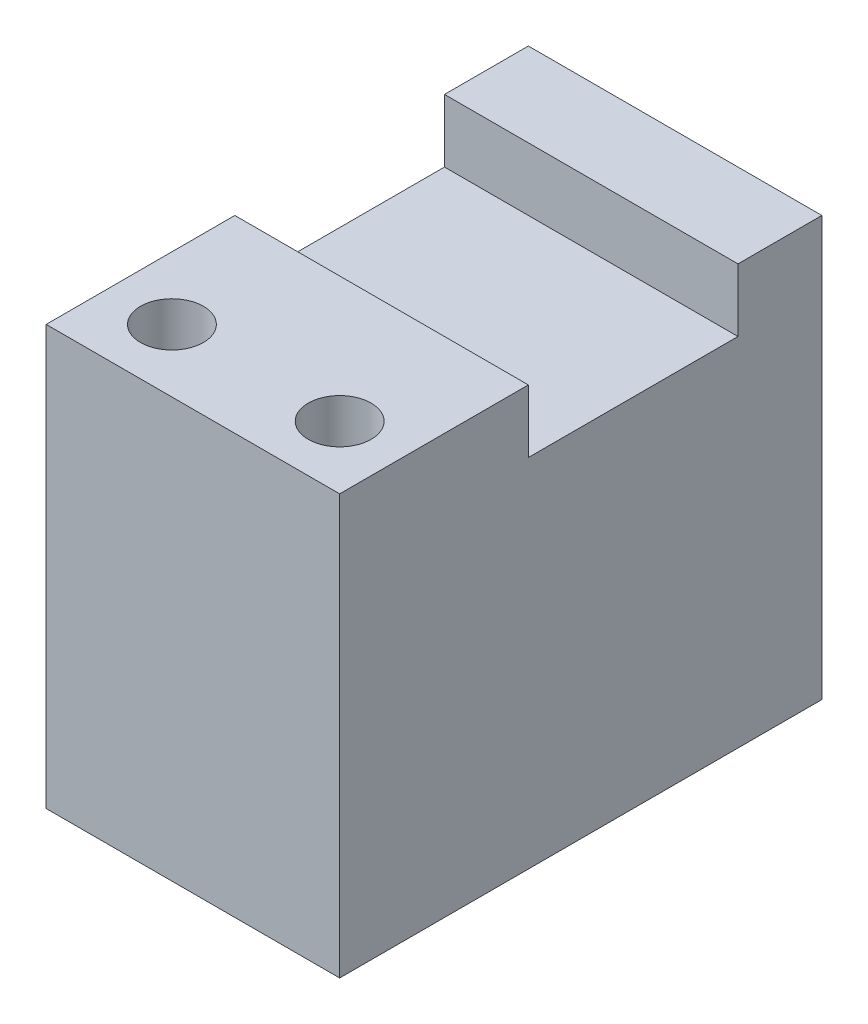
ISO-10303-21;
HEADER;
FILE_DESCRIPTION(('STEP AP214'),'2;1');
FILE_NAME('part.step','',(''),(''),'','','');
FILE_SCHEMA(('AUTOMOTIVE_DESIGN { 1 0 10303 214 1 1 1 1 }'));
ENDSEC;
DATA;
#1=APPLICATION_CONTEXT('core data for automotive mechanical design processes');
#2=APPLICATION_PROTOCOL_DEFINITION('international standard','automotive_design',2000,#1);
#3=PRODUCT_CONTEXT('',#1,'mechanical');
#4=PRODUCT('Part','Part','',(#3));
#5=PRODUCT_RELATED_PRODUCT_CATEGORY('part','',(#4));
#6=PRODUCT_DEFINITION_FORMATION('','',#4);
#7=PRODUCT_DEFINITION_CONTEXT('part definition',#1,'design');
#8=PRODUCT_DEFINITION('design','',#6,#7);
#9=PRODUCT_DEFINITION_SHAPE('','',#8);
#10=(LENGTH_UNIT() NAMED_UNIT(*) SI_UNIT(.MILLI.,.METRE.));
#11=(NAMED_UNIT(*) PLANE_ANGLE_UNIT() SI_UNIT($,.RADIAN.));
#12=(NAMED_UNIT(*) SI_UNIT($,.STERADIAN.) SOLID_ANGLE_UNIT());
#13=UNCERTAINTY_MEASURE_WITH_UNIT(LENGTH_MEASURE(1.E-05),#10,'distance_accuracy_value','');
#14=(GEOMETRIC_REPRESENTATION_CONTEXT(3) GLOBAL_UNCERTAINTY_ASSIGNED_CONTEXT((#13)) GLOBAL_UNIT_ASSIGNED_CONTEXT((#10,
#11,#12)) REPRESENTATION_CONTEXT('',''));
#15=CARTESIAN_POINT('',(0.,0.,0.));
#16=DIRECTION('',(0.,0.,1.));
#17=DIRECTION('',(1.,0.,0.));
#18=AXIS2_PLACEMENT_3D('',#15,#16,#17);
#19=CARTESIAN_POINT('',(0.,-20.,0.));
#20=DIRECTION('',(-1.,0.,0.));
#21=DIRECTION('',(0.,0.,1.));
#22=AXIS2_PLACEMENT_3D('',#19,#20,#21);
#23=PLANE('',#22);
#24=DIRECTION('',(0.,0.,1.));
#25=VECTOR('',#24,1.);
#26=CARTESIAN_POINT('',(0.,-3.,0.));
#27=LINE('',#26,#25);
#28=CARTESIAN_POINT('',(0.,-3.,-19.));
#29=VERTEX_POINT('',#28);
#30=CARTESIAN_POINT('',(0.,-3.,-9.));
#31=VERTEX_POINT('',#30);
#32=EDGE_CURVE('E158',#29,#31,#27,.T.);
#33=ORIENTED_EDGE('',*,*,#32,.F.);
#34=DIRECTION('',(0.,1.,0.));
#35=VECTOR('',#34,1.);
#36=CARTESIAN_POINT('',(0.,-3.,-19.));
#37=LINE('',#36,#35);
#38=CARTESIAN_POINT('',(0.,0.,-19.));
#39=VERTEX_POINT('',#38);
#40=EDGE_CURVE('E178',#29,#39,#37,.T.);
#41=ORIENTED_EDGE('',*,*,#40,.T.);
#42=DIRECTION('',(0.,0.,1.));
#43=VECTOR('',#42,1.);
#44=CARTESIAN_POINT('',(0.,0.,0.));
#45=LINE('',#44,#43);
#46=CARTESIAN_POINT('',(0.,0.,-23.));
#47=VERTEX_POINT('',#46);
#48=EDGE_CURVE('E206',#47,#39,#45,.T.);
#49=ORIENTED_EDGE('',*,*,#48,.F.);
#50=DIRECTION('',(0.,1.,0.));
#51=VECTOR('',#50,1.);
#52=CARTESIAN_POINT('',(0.,-20.,-23.));
#53=LINE('',#52,#51);
#54=CARTESIAN_POINT('',(0.,-20.,-23.));
#55=VERTEX_POINT('',#54);
#56=EDGE_CURVE('E11',#55,#47,#53,.T.);
#57=ORIENTED_EDGE('',*,*,#56,.F.);
#58=DIRECTION('',(0.,0.,1.));
#59=VECTOR('',#58,1.);
#60=CARTESIAN_POINT('',(0.,-20.,0.));
#61=LINE('',#60,#59);
#62=CARTESIAN_POINT('',(0.,-20.,0.));
#63=VERTEX_POINT('',#62);
#64=EDGE_CURVE('E192',#55,#63,#61,.T.);
#65=ORIENTED_EDGE('',*,*,#64,.T.);
#66=DIRECTION('',(0.,1.,0.));
#67=VECTOR('',#66,1.);
#68=CARTESIAN_POINT('',(0.,-20.,0.));
#69=LINE('',#68,#67);
#70=CARTESIAN_POINT('',(0.,0.,0.));
#71=VERTEX_POINT('',#70);
#72=EDGE_CURVE('E44',#63,#71,#69,.T.);
#73=ORIENTED_EDGE('',*,*,#72,.T.);
#74=CARTESIAN_POINT('',(0.,0.,-9.));
#75=VERTEX_POINT('',#74);
#76=EDGE_CURVE('E182',#75,#71,#45,.T.);
#77=ORIENTED_EDGE('',*,*,#76,.F.);
#78=DIRECTION('',(0.,1.,0.));
#79=VECTOR('',#78,1.);
#80=CARTESIAN_POINT('',(0.,-3.,-9.));
#81=LINE('',#80,#79);
#82=EDGE_CURVE('E58',#31,#75,#81,.T.);
#83=ORIENTED_EDGE('',*,*,#82,.F.);
#84=EDGE_LOOP('',(#33,#41,#49,#57,#65,#73,#77,#83));
#85=FACE_BOUND('',#84,.T.);
#86=ADVANCED_FACE('F41',(#85),#23,.T.);
#87=CARTESIAN_POINT('',(14.,-20.,0.));
#88=DIRECTION('',(1.,0.,0.));
#89=DIRECTION('',(0.,0.,-1.));
#90=AXIS2_PLACEMENT_3D('',#87,#88,#89);
#91=PLANE('',#90);
#92=DIRECTION('',(0.,0.,-1.));
#93=VECTOR('',#92,1.);
#94=CARTESIAN_POINT('',(14.,0.,0.));
#95=LINE('',#94,#93);
#96=CARTESIAN_POINT('',(14.,0.,-19.));
#97=VERTEX_POINT('',#96);
#98=CARTESIAN_POINT('',(14.,0.,-23.));
#99=VERTEX_POINT('',#98);
#100=EDGE_CURVE('E214',#97,#99,#95,.T.);
#101=ORIENTED_EDGE('',*,*,#100,.F.);
#102=DIRECTION('',(0.,1.,0.));
#103=VECTOR('',#102,1.);
#104=CARTESIAN_POINT('',(14.,-3.,-19.));
#105=LINE('',#104,#103);
#106=CARTESIAN_POINT('',(14.,-3.,-19.));
#107=VERTEX_POINT('',#106);
#108=EDGE_CURVE('E183',#107,#97,#105,.T.);
#109=ORIENTED_EDGE('',*,*,#108,.F.);
#110=DIRECTION('',(0.,0.,-1.));
#111=VECTOR('',#110,1.);
#112=CARTESIAN_POINT('',(14.,-3.,0.));
#113=LINE('',#112,#111);
#114=CARTESIAN_POINT('',(14.,-3.,-9.));
#115=VERTEX_POINT('',#114);
#116=EDGE_CURVE('E167',#115,#107,#113,.T.);
#117=ORIENTED_EDGE('',*,*,#116,.F.);
#118=DIRECTION('',(0.,1.,0.));
#119=VECTOR('',#118,1.);
#120=CARTESIAN_POINT('',(14.,-3.,-9.));
#121=LINE('',#120,#119);
#122=CARTESIAN_POINT('',(14.,0.,-9.));
#123=VERTEX_POINT('',#122);
#124=EDGE_CURVE('E186',#115,#123,#121,.T.);
#125=ORIENTED_EDGE('',*,*,#124,.T.);
#126=CARTESIAN_POINT('',(14.,0.,0.));
#127=VERTEX_POINT('',#126);
#128=EDGE_CURVE('E215',#127,#123,#95,.T.);
#129=ORIENTED_EDGE('',*,*,#128,.F.);
#130=DIRECTION('',(0.,1.,0.));
#131=VECTOR('',#130,1.);
#132=CARTESIAN_POINT('',(14.,-20.,0.));
#133=LINE('',#132,#131);
#134=CARTESIAN_POINT('',(14.,-20.,0.));
#135=VERTEX_POINT('',#134);
#136=EDGE_CURVE('E224',#135,#127,#133,.T.);
#137=ORIENTED_EDGE('',*,*,#136,.F.);
#138=DIRECTION('',(0.,0.,-1.));
#139=VECTOR('',#138,1.);
#140=CARTESIAN_POINT('',(14.,-20.,0.));
#141=LINE('',#140,#139);
#142=CARTESIAN_POINT('',(14.,-20.,-23.));
#143=VERTEX_POINT('',#142);
#144=EDGE_CURVE('E199',#135,#143,#141,.T.);
#145=ORIENTED_EDGE('',*,*,#144,.T.);
#146=DIRECTION('',(0.,1.,0.));
#147=VECTOR('',#146,1.);
#148=CARTESIAN_POINT('',(14.,-20.,-23.));
#149=LINE('',#148,#147);
#150=EDGE_CURVE('E50',#143,#99,#149,.T.);
#151=ORIENTED_EDGE('',*,*,#150,.T.);
#152=EDGE_LOOP('',(#101,#109,#117,#125,#129,#137,#145,#151));
#153=FACE_BOUND('',#152,.T.);
#154=ADVANCED_FACE('F262',(#153),#91,.T.);
#155=CARTESIAN_POINT('',(0.,0.,0.));
#156=DIRECTION('',(0.,-1.,0.));
#157=DIRECTION('',(0.,0.,-1.));
#158=AXIS2_PLACEMENT_3D('',#155,#156,#157);
#159=PLANE('',#158);
#160=DIRECTION('',(1.,0.,0.));
#161=VECTOR('',#160,1.);
#162=CARTESIAN_POINT('',(0.,0.,-19.));
#163=LINE('',#162,#161);
#164=EDGE_CURVE('E163',#39,#97,#163,.T.);
#165=ORIENTED_EDGE('',*,*,#164,.T.);
#166=ORIENTED_EDGE('',*,*,#100,.T.);
#167=DIRECTION('',(-1.,0.,0.));
#168=VECTOR('',#167,1.);
#169=CARTESIAN_POINT('',(0.,0.,-23.));
#170=LINE('',#169,#168);
#171=EDGE_CURVE('E196',#99,#47,#170,.T.);
#172=ORIENTED_EDGE('',*,*,#171,.T.);
#173=ORIENTED_EDGE('',*,*,#48,.T.);
#174=EDGE_LOOP('',(#165,#166,#172,#173));
#175=FACE_BOUND('',#174,.T.);
#176=ADVANCED_FACE('F259',(#175),#159,.F.);
#177=CARTESIAN_POINT('',(0.,-20.,-23.));
#178=DIRECTION('',(0.,0.,-1.));
#179=DIRECTION('',(-1.,0.,0.));
#180=AXIS2_PLACEMENT_3D('',#177,#178,#179);
#181=PLANE('',#180);
#182=ORIENTED_EDGE('',*,*,#171,.F.);
#183=ORIENTED_EDGE('',*,*,#150,.F.);
#184=DIRECTION('',(-1.,0.,0.));
#185=VECTOR('',#184,1.);
#186=CARTESIAN_POINT('',(0.,-20.,-23.));
#187=LINE('',#186,#185);
#188=EDGE_CURVE('E203',#143,#55,#187,.T.);
#189=ORIENTED_EDGE('',*,*,#188,.T.);
#190=ORIENTED_EDGE('',*,*,#56,.T.);
#191=EDGE_LOOP('',(#182,#183,#189,#190));
#192=FACE_BOUND('',#191,.T.);
#193=ADVANCED_FACE('F265',(#192),#181,.T.);
#194=CARTESIAN_POINT('',(0.,-20.,0.));
#195=DIRECTION('',(0.,0.,1.));
#196=DIRECTION('',(1.,0.,0.));
#197=AXIS2_PLACEMENT_3D('',#194,#195,#196);
#198=PLANE('',#197);
#199=DIRECTION('',(1.,0.,0.));
#200=VECTOR('',#199,1.);
#201=CARTESIAN_POINT('',(0.,0.,0.));
#202=LINE('',#201,#200);
#203=EDGE_CURVE('E210',#71,#127,#202,.T.);
#204=ORIENTED_EDGE('',*,*,#203,.F.);
#205=ORIENTED_EDGE('',*,*,#72,.F.);
#206=DIRECTION('',(1.,0.,0.));
#207=VECTOR('',#206,1.);
#208=CARTESIAN_POINT('',(0.,-20.,0.));
#209=LINE('',#208,#207);
#210=EDGE_CURVE('E195',#63,#135,#209,.T.);
#211=ORIENTED_EDGE('',*,*,#210,.T.);
#212=ORIENTED_EDGE('',*,*,#136,.T.);
#213=EDGE_LOOP('',(#204,#205,#211,#212));
#214=FACE_BOUND('',#213,.T.);
#215=ADVANCED_FACE('F232',(#214),#198,.T.);
#216=CARTESIAN_POINT('',(0.,-20.,0.));
#217=DIRECTION('',(0.,-1.,0.));
#218=DIRECTION('',(0.,0.,-1.));
#219=AXIS2_PLACEMENT_3D('',#216,#217,#218);
#220=PLANE('',#219);
#221=CARTESIAN_POINT('',(7.,-20.,-15.));
#222=DIRECTION('',(0.,-1.,0.));
#223=DIRECTION('',(0.,0.,-1.));
#224=AXIS2_PLACEMENT_3D('',#221,#222,#223);
#225=CIRCLE('',#224,4.49999999999999);
#226=CARTESIAN_POINT('',(7.,-20.,-19.5));
#227=VERTEX_POINT('',#226);
#228=EDGE_CURVE('E134',#227,#227,#225,.T.);
#229=ORIENTED_EDGE('',*,*,#228,.F.);
#230=EDGE_LOOP('',(#229));
#231=FACE_BOUND('',#230,.T.);
#232=ORIENTED_EDGE('',*,*,#64,.F.);
#233=ORIENTED_EDGE('',*,*,#188,.F.);
#234=ORIENTED_EDGE('',*,*,#144,.F.);
#235=ORIENTED_EDGE('',*,*,#210,.F.);
#236=EDGE_LOOP('',(#232,#233,#234,#235));
#237=FACE_BOUND('',#236,.T.);
#238=ADVANCED_FACE('F272',(#231,#237),#220,.T.);
#239=CARTESIAN_POINT('',(11.,0.,-3.));
#240=DIRECTION('',(0.,1.,0.));
#241=DIRECTION('',(0.,0.,1.));
#242=AXIS2_PLACEMENT_3D('',#239,#240,#241);
#243=CIRCLE('',#242,1.5);
#244=CARTESIAN_POINT('',(11.,0.,-1.5));
#245=VERTEX_POINT('',#244);
#246=EDGE_CURVE('E133',#245,#245,#243,.T.);
#247=ORIENTED_EDGE('',*,*,#246,.F.);
#248=EDGE_LOOP('',(#247));
#249=FACE_BOUND('',#248,.T.);
#250=CARTESIAN_POINT('',(3.,0.,-3.));
#251=DIRECTION('',(0.,1.,0.));
#252=DIRECTION('',(0.,0.,1.));
#253=AXIS2_PLACEMENT_3D('',#250,#251,#252);
#254=CIRCLE('',#253,1.5);
#255=CARTESIAN_POINT('',(3.,0.,-1.5));
#256=VERTEX_POINT('',#255);
#257=EDGE_CURVE('E149',#256,#256,#254,.T.);
#258=ORIENTED_EDGE('',*,*,#257,.F.);
#259=EDGE_LOOP('',(#258));
#260=FACE_BOUND('',#259,.T.);
#261=ORIENTED_EDGE('',*,*,#128,.T.);
#262=DIRECTION('',(1.,0.,0.));
#263=VECTOR('',#262,1.);
#264=CARTESIAN_POINT('',(0.,0.,-9.));
#265=LINE('',#264,#263);
#266=EDGE_CURVE('E157',#75,#123,#265,.T.);
#267=ORIENTED_EDGE('',*,*,#266,.F.);
#268=ORIENTED_EDGE('',*,*,#76,.T.);
#269=ORIENTED_EDGE('',*,*,#203,.T.);
#270=EDGE_LOOP('',(#261,#267,#268,#269));
#271=FACE_BOUND('',#270,.T.);
#272=ADVANCED_FACE('F234',(#249,#260,#271),#159,.F.);
#273=CARTESIAN_POINT('',(0.,-3.,-19.));
#274=DIRECTION('',(0.,0.,1.));
#275=DIRECTION('',(1.,0.,0.));
#276=AXIS2_PLACEMENT_3D('',#273,#274,#275);
#277=PLANE('',#276);
#278=ORIENTED_EDGE('',*,*,#164,.F.);
#279=ORIENTED_EDGE('',*,*,#40,.F.);
#280=DIRECTION('',(1.,0.,0.));
#281=VECTOR('',#280,1.);
#282=CARTESIAN_POINT('',(0.,-3.,-19.));
#283=LINE('',#282,#281);
#284=EDGE_CURVE('E171',#29,#107,#283,.T.);
#285=ORIENTED_EDGE('',*,*,#284,.T.);
#286=ORIENTED_EDGE('',*,*,#108,.T.);
#287=EDGE_LOOP('',(#278,#279,#285,#286));
#288=FACE_BOUND('',#287,.T.);
#289=ADVANCED_FACE('F299',(#288),#277,.T.);
#290=CARTESIAN_POINT('',(0.,-3.,-9.));
#291=DIRECTION('',(0.,0.,1.));
#292=DIRECTION('',(1.,0.,0.));
#293=AXIS2_PLACEMENT_3D('',#290,#291,#292);
#294=PLANE('',#293);
#295=ORIENTED_EDGE('',*,*,#266,.T.);
#296=ORIENTED_EDGE('',*,*,#124,.F.);
#297=DIRECTION('',(1.,0.,0.));
#298=VECTOR('',#297,1.);
#299=CARTESIAN_POINT('',(0.,-3.,-9.));
#300=LINE('',#299,#298);
#301=EDGE_CURVE('E162',#31,#115,#300,.T.);
#302=ORIENTED_EDGE('',*,*,#301,.F.);
#303=ORIENTED_EDGE('',*,*,#82,.T.);
#304=EDGE_LOOP('',(#295,#296,#302,#303));
#305=FACE_BOUND('',#304,.T.);
#306=ADVANCED_FACE('F313',(#305),#294,.F.);
#307=CARTESIAN_POINT('',(0.,-3.,0.));
#308=DIRECTION('',(0.,1.,0.));
#309=DIRECTION('',(0.,0.,1.));
#310=AXIS2_PLACEMENT_3D('',#307,#308,#309);
#311=PLANE('',#310);
#312=ORIENTED_EDGE('',*,*,#32,.T.);
#313=ORIENTED_EDGE('',*,*,#301,.T.);
#314=ORIENTED_EDGE('',*,*,#116,.T.);
#315=ORIENTED_EDGE('',*,*,#284,.F.);
#316=EDGE_LOOP('',(#312,#313,#314,#315));
#317=FACE_BOUND('',#316,.T.);
#318=ADVANCED_FACE('F320',(#317),#311,.T.);
#319=CARTESIAN_POINT('',(3.,-5.,-3.));
#320=DIRECTION('',(0.,1.,0.));
#321=DIRECTION('',(0.,0.,1.));
#322=AXIS2_PLACEMENT_3D('',#319,#320,#321);
#323=CONICAL_SURFACE('',#322,1.5,1.02974425867665);
#324=CARTESIAN_POINT('',(3.,-5.90129092854134,-3.));
#325=VERTEX_POINT('',#324);
#326=VERTEX_LOOP('',#325);
#327=FACE_BOUND('',#326,.T.);
#328=CARTESIAN_POINT('',(3.,-5.,-3.));
#329=DIRECTION('',(0.,1.,0.));
#330=DIRECTION('',(0.,0.,1.));
#331=AXIS2_PLACEMENT_3D('',#328,#329,#330);
#332=CIRCLE('',#331,1.5);
#333=CARTESIAN_POINT('',(3.,-5.,-1.5));
#334=VERTEX_POINT('',#333);
#335=EDGE_CURVE('E153',#334,#334,#332,.T.);
#336=ORIENTED_EDGE('',*,*,#335,.T.);
#337=EDGE_LOOP('',(#336));
#338=FACE_BOUND('',#337,.T.);
#339=ADVANCED_FACE('F327',(#327,#338),#323,.F.);
#340=CARTESIAN_POINT('',(3.,0.,-3.));
#341=DIRECTION('',(0.,1.,0.));
#342=DIRECTION('',(0.,0.,1.));
#343=AXIS2_PLACEMENT_3D('',#340,#341,#342);
#344=CYLINDRICAL_SURFACE('',#343,1.5);
#345=ORIENTED_EDGE('',*,*,#335,.F.);
#346=EDGE_LOOP('',(#345));
#347=FACE_BOUND('',#346,.T.);
#348=ORIENTED_EDGE('',*,*,#257,.T.);
#349=EDGE_LOOP('',(#348));
#350=FACE_BOUND('',#349,.T.);
#351=ADVANCED_FACE('F335',(#347,#350),#344,.F.);
#352=CARTESIAN_POINT('',(11.,-5.,-3.));
#353=DIRECTION('',(0.,1.,0.));
#354=DIRECTION('',(0.,0.,1.));
#355=AXIS2_PLACEMENT_3D('',#352,#353,#354);
#356=CONICAL_SURFACE('',#355,1.5,1.02974425867665);
#357=CARTESIAN_POINT('',(11.,-5.90129092854134,-3.));
#358=VERTEX_POINT('',#357);
#359=VERTEX_LOOP('',#358);
#360=FACE_BOUND('',#359,.T.);
#361=CARTESIAN_POINT('',(11.,-5.,-3.));
#362=DIRECTION('',(0.,1.,0.));
#363=DIRECTION('',(0.,0.,1.));
#364=AXIS2_PLACEMENT_3D('',#361,#362,#363);
#365=CIRCLE('',#364,1.5);
#366=CARTESIAN_POINT('',(11.,-5.,-1.5));
#367=VERTEX_POINT('',#366);
#368=EDGE_CURVE('E141',#367,#367,#365,.T.);
#369=ORIENTED_EDGE('',*,*,#368,.T.);
#370=EDGE_LOOP('',(#369));
#371=FACE_BOUND('',#370,.T.);
#372=ADVANCED_FACE('F343',(#360,#371),#356,.F.);
#373=CARTESIAN_POINT('',(11.,0.,-3.));
#374=DIRECTION('',(0.,1.,0.));
#375=DIRECTION('',(0.,0.,1.));
#376=AXIS2_PLACEMENT_3D('',#373,#374,#375);
#377=CYLINDRICAL_SURFACE('',#376,1.5);
#378=ORIENTED_EDGE('',*,*,#368,.F.);
#379=EDGE_LOOP('',(#378));
#380=FACE_BOUND('',#379,.T.);
#381=ORIENTED_EDGE('',*,*,#246,.T.);
#382=EDGE_LOOP('',(#381));
#383=FACE_BOUND('',#382,.T.);
#384=ADVANCED_FACE('F126',(#380,#383),#377,.F.);
#385=CARTESIAN_POINT('',(7.,-8.,-15.));
#386=DIRECTION('',(0.,-1.,0.));
#387=DIRECTION('',(0.,0.,-1.));
#388=AXIS2_PLACEMENT_3D('',#385,#386,#387);
#389=CONICAL_SURFACE('',#388,4.5,1.02974425867665);
#390=CARTESIAN_POINT('',(6.99999999999999,-5.29612721437598,-15.));
#391=VERTEX_POINT('',#390);
#392=VERTEX_LOOP('',#391);
#393=FACE_BOUND('',#392,.T.);
#394=CARTESIAN_POINT('',(7.,-8.,-15.));
#395=DIRECTION('',(0.,-1.,0.));
#396=DIRECTION('',(0.,0.,-1.));
#397=AXIS2_PLACEMENT_3D('',#394,#395,#396);
#398=CIRCLE('',#397,4.5);
#399=CARTESIAN_POINT('',(7.,-8.,-19.5));
#400=VERTEX_POINT('',#399);
#401=EDGE_CURVE('E130',#400,#400,#398,.T.);
#402=ORIENTED_EDGE('',*,*,#401,.T.);
#403=EDGE_LOOP('',(#402));
#404=FACE_BOUND('',#403,.T.);
#405=ADVANCED_FACE('F122',(#393,#404),#389,.F.);
#406=CARTESIAN_POINT('',(7.,-20.,-15.));
#407=DIRECTION('',(0.,-1.,0.));
#408=DIRECTION('',(0.,0.,-1.));
#409=AXIS2_PLACEMENT_3D('',#406,#407,#408);
#410=CYLINDRICAL_SURFACE('',#409,4.49999999999999);
#411=ORIENTED_EDGE('',*,*,#401,.F.);
#412=EDGE_LOOP('',(#411));
#413=FACE_BOUND('',#412,.T.);
#414=ORIENTED_EDGE('',*,*,#228,.T.);
#415=EDGE_LOOP('',(#414));
#416=FACE_BOUND('',#415,.T.);
#417=ADVANCED_FACE('F125',(#413,#416),#410,.F.);
#418=CLOSED_SHELL('',(#86,#154,#176,#193,#215,#238,#272,#289,#306,#318,#339,#351,#372,#384,#405,#417));
#419=MANIFOLD_SOLID_BREP('B2',#418);
#420=ADVANCED_BREP_SHAPE_REPRESENTATION('',(#18,#419),#14);
#421=SHAPE_DEFINITION_REPRESENTATION(#9,#420);
ENDSEC;
END-ISO-10303-21;
